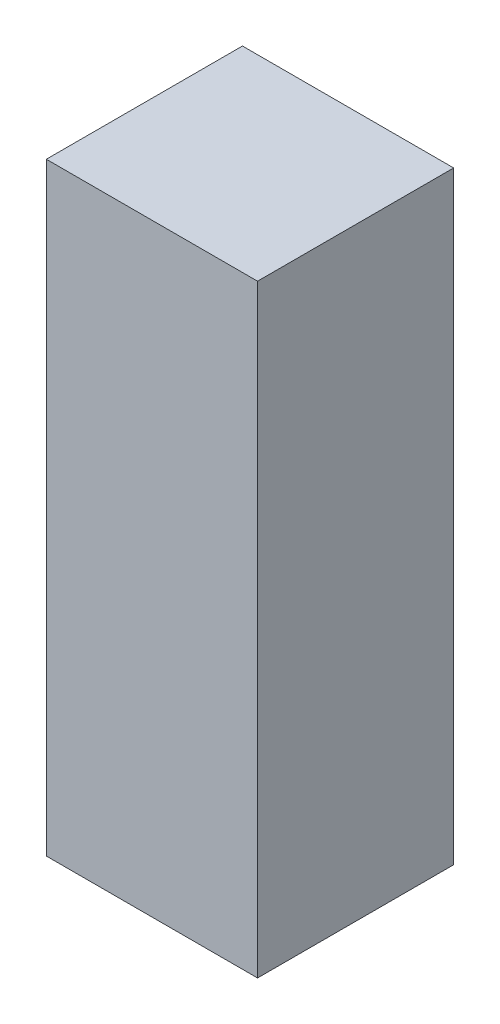
ISO-10303-21;
HEADER;
FILE_DESCRIPTION(('STEP AP214'),'2;1');
FILE_NAME('part.step','',(''),(''),'','','');
FILE_SCHEMA(('AUTOMOTIVE_DESIGN { 1 0 10303 214 1 1 1 1 }'));
ENDSEC;
DATA;
#1=APPLICATION_CONTEXT('core data for automotive mechanical design processes');
#2=APPLICATION_PROTOCOL_DEFINITION('international standard','automotive_design',2000,#1);
#3=PRODUCT_CONTEXT('',#1,'mechanical');
#4=PRODUCT('Part','Part','',(#3));
#5=PRODUCT_RELATED_PRODUCT_CATEGORY('part','',(#4));
#6=PRODUCT_DEFINITION_FORMATION('','',#4);
#7=PRODUCT_DEFINITION_CONTEXT('part definition',#1,'design');
#8=PRODUCT_DEFINITION('design','',#6,#7);
#9=PRODUCT_DEFINITION_SHAPE('','',#8);
#10=(LENGTH_UNIT() NAMED_UNIT(*) SI_UNIT(.MILLI.,.METRE.));
#11=(NAMED_UNIT(*) PLANE_ANGLE_UNIT() SI_UNIT($,.RADIAN.));
#12=(NAMED_UNIT(*) SI_UNIT($,.STERADIAN.) SOLID_ANGLE_UNIT());
#13=UNCERTAINTY_MEASURE_WITH_UNIT(LENGTH_MEASURE(1.E-05),#10,'distance_accuracy_value','');
#14=(GEOMETRIC_REPRESENTATION_CONTEXT(3) GLOBAL_UNCERTAINTY_ASSIGNED_CONTEXT((#13)) GLOBAL_UNIT_ASSIGNED_CONTEXT((#10,
#11,#12)) REPRESENTATION_CONTEXT('',''));
#15=CARTESIAN_POINT('',(0.,0.,0.));
#16=DIRECTION('',(0.,0.,1.));
#17=DIRECTION('',(1.,0.,0.));
#18=AXIS2_PLACEMENT_3D('',#15,#16,#17);
#19=CARTESIAN_POINT('',(24.,1080.,33.));
#20=DIRECTION('',(1.,0.,0.));
#21=DIRECTION('',(0.,0.,-1.));
#22=AXIS2_PLACEMENT_3D('',#19,#20,#21);
#23=PLANE('',#22);
#24=DIRECTION('',(0.,-1.,0.));
#25=VECTOR('',#24,1.);
#26=CARTESIAN_POINT('',(24.,1080.,20.));
#27=LINE('',#26,#25);
#28=CARTESIAN_POINT('',(24.,1120.,20.));
#29=VERTEX_POINT('',#28);
#30=CARTESIAN_POINT('',(24.,1080.,20.));
#31=VERTEX_POINT('',#30);
#32=EDGE_CURVE('E102',#29,#31,#27,.T.);
#33=ORIENTED_EDGE('',*,*,#32,.T.);
#34=DIRECTION('',(0.,0.,-1.));
#35=VECTOR('',#34,1.);
#36=CARTESIAN_POINT('',(24.,1080.,33.));
#37=LINE('',#36,#35);
#38=CARTESIAN_POINT('',(24.,1080.,33.));
#39=VERTEX_POINT('',#38);
#40=EDGE_CURVE('E11',#39,#31,#37,.T.);
#41=ORIENTED_EDGE('',*,*,#40,.F.);
#42=DIRECTION('',(0.,-1.,0.));
#43=VECTOR('',#42,1.);
#44=CARTESIAN_POINT('',(24.,1080.,33.));
#45=LINE('',#44,#43);
#46=CARTESIAN_POINT('',(24.,1120.,33.));
#47=VERTEX_POINT('',#46);
#48=EDGE_CURVE('E90',#47,#39,#45,.T.);
#49=ORIENTED_EDGE('',*,*,#48,.F.);
#50=DIRECTION('',(0.,0.,-1.));
#51=VECTOR('',#50,1.);
#52=CARTESIAN_POINT('',(24.,1120.,33.));
#53=LINE('',#52,#51);
#54=EDGE_CURVE('E98',#47,#29,#53,.T.);
#55=ORIENTED_EDGE('',*,*,#54,.T.);
#56=EDGE_LOOP('',(#33,#41,#49,#55));
#57=FACE_BOUND('',#56,.T.);
#58=ADVANCED_FACE('F39',(#57),#23,.F.);
#59=CARTESIAN_POINT('',(24.,1080.,33.));
#60=DIRECTION('',(0.,1.,0.));
#61=DIRECTION('',(0.,0.,1.));
#62=AXIS2_PLACEMENT_3D('',#59,#60,#61);
#63=PLANE('',#62);
#64=DIRECTION('',(1.,0.,0.));
#65=VECTOR('',#64,1.);
#66=CARTESIAN_POINT('',(24.,1080.,20.));
#67=LINE('',#66,#65);
#68=CARTESIAN_POINT('',(38.,1080.,20.));
#69=VERTEX_POINT('',#68);
#70=EDGE_CURVE('E94',#31,#69,#67,.T.);
#71=ORIENTED_EDGE('',*,*,#70,.T.);
#72=DIRECTION('',(0.,0.,-1.));
#73=VECTOR('',#72,1.);
#74=CARTESIAN_POINT('',(38.,1080.,33.));
#75=LINE('',#74,#73);
#76=CARTESIAN_POINT('',(38.,1080.,33.));
#77=VERTEX_POINT('',#76);
#78=EDGE_CURVE('E47',#77,#69,#75,.T.);
#79=ORIENTED_EDGE('',*,*,#78,.F.);
#80=DIRECTION('',(1.,0.,0.));
#81=VECTOR('',#80,1.);
#82=CARTESIAN_POINT('',(24.,1080.,33.));
#83=LINE('',#82,#81);
#84=EDGE_CURVE('E85',#39,#77,#83,.T.);
#85=ORIENTED_EDGE('',*,*,#84,.F.);
#86=ORIENTED_EDGE('',*,*,#40,.T.);
#87=EDGE_LOOP('',(#71,#79,#85,#86));
#88=FACE_BOUND('',#87,.T.);
#89=ADVANCED_FACE('F93',(#88),#63,.F.);
#90=CARTESIAN_POINT('',(38.,1080.,33.));
#91=DIRECTION('',(-1.,0.,0.));
#92=DIRECTION('',(0.,0.,1.));
#93=AXIS2_PLACEMENT_3D('',#90,#91,#92);
#94=PLANE('',#93);
#95=DIRECTION('',(0.,1.,0.));
#96=VECTOR('',#95,1.);
#97=CARTESIAN_POINT('',(38.,1080.,20.));
#98=LINE('',#97,#96);
#99=CARTESIAN_POINT('',(38.,1120.,20.));
#100=VERTEX_POINT('',#99);
#101=EDGE_CURVE('E72',#69,#100,#98,.T.);
#102=ORIENTED_EDGE('',*,*,#101,.T.);
#103=DIRECTION('',(0.,0.,-1.));
#104=VECTOR('',#103,1.);
#105=CARTESIAN_POINT('',(38.,1120.,33.));
#106=LINE('',#105,#104);
#107=CARTESIAN_POINT('',(38.,1120.,33.));
#108=VERTEX_POINT('',#107);
#109=EDGE_CURVE('E95',#108,#100,#106,.T.);
#110=ORIENTED_EDGE('',*,*,#109,.F.);
#111=DIRECTION('',(0.,1.,0.));
#112=VECTOR('',#111,1.);
#113=CARTESIAN_POINT('',(38.,1080.,33.));
#114=LINE('',#113,#112);
#115=EDGE_CURVE('E88',#77,#108,#114,.T.);
#116=ORIENTED_EDGE('',*,*,#115,.F.);
#117=ORIENTED_EDGE('',*,*,#78,.T.);
#118=EDGE_LOOP('',(#102,#110,#116,#117));
#119=FACE_BOUND('',#118,.T.);
#120=ADVANCED_FACE('F96',(#119),#94,.F.);
#121=CARTESIAN_POINT('',(24.,1120.,33.));
#122=DIRECTION('',(0.,-1.,0.));
#123=DIRECTION('',(0.,0.,-1.));
#124=AXIS2_PLACEMENT_3D('',#121,#122,#123);
#125=PLANE('',#124);
#126=DIRECTION('',(-1.,0.,0.));
#127=VECTOR('',#126,1.);
#128=CARTESIAN_POINT('',(24.,1120.,20.));
#129=LINE('',#128,#127);
#130=EDGE_CURVE('E78',#100,#29,#129,.T.);
#131=ORIENTED_EDGE('',*,*,#130,.T.);
#132=ORIENTED_EDGE('',*,*,#54,.F.);
#133=DIRECTION('',(-1.,0.,0.));
#134=VECTOR('',#133,1.);
#135=CARTESIAN_POINT('',(24.,1120.,33.));
#136=LINE('',#135,#134);
#137=EDGE_CURVE('E55',#108,#47,#136,.T.);
#138=ORIENTED_EDGE('',*,*,#137,.F.);
#139=ORIENTED_EDGE('',*,*,#109,.T.);
#140=EDGE_LOOP('',(#131,#132,#138,#139));
#141=FACE_BOUND('',#140,.T.);
#142=ADVANCED_FACE('F109',(#141),#125,.F.);
#143=CARTESIAN_POINT('',(0.,0.,33.));
#144=DIRECTION('',(0.,0.,-1.));
#145=DIRECTION('',(-1.,0.,0.));
#146=AXIS2_PLACEMENT_3D('',#143,#144,#145);
#147=PLANE('',#146);
#148=ORIENTED_EDGE('',*,*,#48,.T.);
#149=ORIENTED_EDGE('',*,*,#84,.T.);
#150=ORIENTED_EDGE('',*,*,#115,.T.);
#151=ORIENTED_EDGE('',*,*,#137,.T.);
#152=EDGE_LOOP('',(#148,#149,#150,#151));
#153=FACE_BOUND('',#152,.T.);
#154=ADVANCED_FACE('F86',(#153),#147,.F.);
#155=CARTESIAN_POINT('',(0.,0.,20.));
#156=DIRECTION('',(0.,0.,-1.));
#157=DIRECTION('',(-1.,0.,0.));
#158=AXIS2_PLACEMENT_3D('',#155,#156,#157);
#159=PLANE('',#158);
#160=ORIENTED_EDGE('',*,*,#32,.F.);
#161=ORIENTED_EDGE('',*,*,#130,.F.);
#162=ORIENTED_EDGE('',*,*,#101,.F.);
#163=ORIENTED_EDGE('',*,*,#70,.F.);
#164=EDGE_LOOP('',(#160,#161,#162,#163));
#165=FACE_BOUND('',#164,.T.);
#166=ADVANCED_FACE('F112',(#165),#159,.T.);
#167=CLOSED_SHELL('',(#58,#89,#120,#142,#154,#166));
#168=MANIFOLD_SOLID_BREP('B2',#167);
#169=ADVANCED_BREP_SHAPE_REPRESENTATION('',(#18,#168),#14);
#170=SHAPE_DEFINITION_REPRESENTATION(#9,#169);
ENDSEC;
END-ISO-10303-21;
